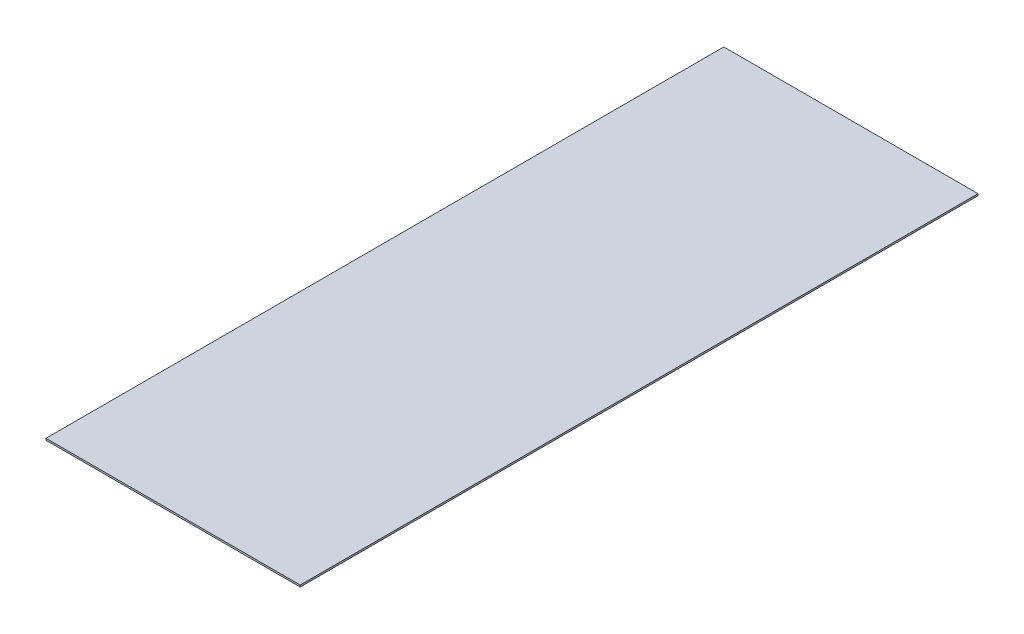
ISO-10303-21;
HEADER;
FILE_DESCRIPTION(('STEP AP214'),'2;1');
FILE_NAME('part.step','',(''),(''),'','','');
FILE_SCHEMA(('AUTOMOTIVE_DESIGN { 1 0 10303 214 1 1 1 1 }'));
ENDSEC;
DATA;
#1=APPLICATION_CONTEXT('core data for automotive mechanical design processes');
#2=APPLICATION_PROTOCOL_DEFINITION('international standard','automotive_design',2000,#1);
#3=PRODUCT_CONTEXT('',#1,'mechanical');
#4=PRODUCT('Part','Part','',(#3));
#5=PRODUCT_RELATED_PRODUCT_CATEGORY('part','',(#4));
#6=PRODUCT_DEFINITION_FORMATION('','',#4);
#7=PRODUCT_DEFINITION_CONTEXT('part definition',#1,'design');
#8=PRODUCT_DEFINITION('design','',#6,#7);
#9=PRODUCT_DEFINITION_SHAPE('','',#8);
#10=(LENGTH_UNIT() NAMED_UNIT(*) SI_UNIT(.MILLI.,.METRE.));
#11=(NAMED_UNIT(*) PLANE_ANGLE_UNIT() SI_UNIT($,.RADIAN.));
#12=(NAMED_UNIT(*) SI_UNIT($,.STERADIAN.) SOLID_ANGLE_UNIT());
#13=UNCERTAINTY_MEASURE_WITH_UNIT(LENGTH_MEASURE(1.E-05),#10,'distance_accuracy_value','');
#14=(GEOMETRIC_REPRESENTATION_CONTEXT(3) GLOBAL_UNCERTAINTY_ASSIGNED_CONTEXT((#13)) GLOBAL_UNIT_ASSIGNED_CONTEXT((#10,
#11,#12)) REPRESENTATION_CONTEXT('',''));
#15=CARTESIAN_POINT('',(0.,0.,0.));
#16=DIRECTION('',(0.,0.,1.));
#17=DIRECTION('',(1.,0.,0.));
#18=AXIS2_PLACEMENT_3D('',#15,#16,#17);
#19=CARTESIAN_POINT('',(457.2,6.4,1219.2));
#20=DIRECTION('',(-1.,0.,0.));
#21=DIRECTION('',(0.,0.,1.));
#22=AXIS2_PLACEMENT_3D('',#19,#20,#21);
#23=PLANE('',#22);
#24=DIRECTION('',(0.,0.,-1.));
#25=VECTOR('',#24,1.);
#26=CARTESIAN_POINT('',(457.2,0.,1219.2));
#27=LINE('',#26,#25);
#28=CARTESIAN_POINT('',(457.2,0.,1219.2));
#29=VERTEX_POINT('',#28);
#30=CARTESIAN_POINT('',(457.2,0.,-1219.2));
#31=VERTEX_POINT('',#30);
#32=EDGE_CURVE('E96',#29,#31,#27,.T.);
#33=ORIENTED_EDGE('',*,*,#32,.T.);
#34=DIRECTION('',(0.,-1.,0.));
#35=VECTOR('',#34,1.);
#36=CARTESIAN_POINT('',(457.2,6.4,-1219.2));
#37=LINE('',#36,#35);
#38=CARTESIAN_POINT('',(457.2,6.4,-1219.2));
#39=VERTEX_POINT('',#38);
#40=EDGE_CURVE('E11',#39,#31,#37,.T.);
#41=ORIENTED_EDGE('',*,*,#40,.F.);
#42=DIRECTION('',(0.,0.,-1.));
#43=VECTOR('',#42,1.);
#44=CARTESIAN_POINT('',(457.2,6.4,1219.2));
#45=LINE('',#44,#43);
#46=CARTESIAN_POINT('',(457.2,6.4,1219.2));
#47=VERTEX_POINT('',#46);
#48=EDGE_CURVE('E84',#47,#39,#45,.T.);
#49=ORIENTED_EDGE('',*,*,#48,.F.);
#50=DIRECTION('',(0.,-1.,0.));
#51=VECTOR('',#50,1.);
#52=CARTESIAN_POINT('',(457.2,6.4,1219.2));
#53=LINE('',#52,#51);
#54=EDGE_CURVE('E92',#47,#29,#53,.T.);
#55=ORIENTED_EDGE('',*,*,#54,.T.);
#56=EDGE_LOOP('',(#33,#41,#49,#55));
#57=FACE_BOUND('',#56,.T.);
#58=ADVANCED_FACE('F33',(#57),#23,.F.);
#59=CARTESIAN_POINT('',(-457.2,6.4,-1219.2));
#60=DIRECTION('',(0.,0.,1.));
#61=DIRECTION('',(1.,0.,0.));
#62=AXIS2_PLACEMENT_3D('',#59,#60,#61);
#63=PLANE('',#62);
#64=DIRECTION('',(-1.,0.,0.));
#65=VECTOR('',#64,1.);
#66=CARTESIAN_POINT('',(-457.2,0.,-1219.2));
#67=LINE('',#66,#65);
#68=CARTESIAN_POINT('',(-457.2,0.,-1219.2));
#69=VERTEX_POINT('',#68);
#70=EDGE_CURVE('E88',#31,#69,#67,.T.);
#71=ORIENTED_EDGE('',*,*,#70,.T.);
#72=DIRECTION('',(0.,-1.,0.));
#73=VECTOR('',#72,1.);
#74=CARTESIAN_POINT('',(-457.2,6.4,-1219.2));
#75=LINE('',#74,#73);
#76=CARTESIAN_POINT('',(-457.2,6.4,-1219.2));
#77=VERTEX_POINT('',#76);
#78=EDGE_CURVE('E41',#77,#69,#75,.T.);
#79=ORIENTED_EDGE('',*,*,#78,.F.);
#80=DIRECTION('',(-1.,0.,0.));
#81=VECTOR('',#80,1.);
#82=CARTESIAN_POINT('',(-457.2,6.4,-1219.2));
#83=LINE('',#82,#81);
#84=EDGE_CURVE('E79',#39,#77,#83,.T.);
#85=ORIENTED_EDGE('',*,*,#84,.F.);
#86=ORIENTED_EDGE('',*,*,#40,.T.);
#87=EDGE_LOOP('',(#71,#79,#85,#86));
#88=FACE_BOUND('',#87,.T.);
#89=ADVANCED_FACE('F87',(#88),#63,.F.);
#90=CARTESIAN_POINT('',(-457.2,6.4,1219.2));
#91=DIRECTION('',(1.,0.,0.));
#92=DIRECTION('',(0.,0.,-1.));
#93=AXIS2_PLACEMENT_3D('',#90,#91,#92);
#94=PLANE('',#93);
#95=DIRECTION('',(0.,0.,1.));
#96=VECTOR('',#95,1.);
#97=CARTESIAN_POINT('',(-457.2,0.,1219.2));
#98=LINE('',#97,#96);
#99=CARTESIAN_POINT('',(-457.2,0.,1219.2));
#100=VERTEX_POINT('',#99);
#101=EDGE_CURVE('E66',#69,#100,#98,.T.);
#102=ORIENTED_EDGE('',*,*,#101,.T.);
#103=DIRECTION('',(0.,-1.,0.));
#104=VECTOR('',#103,1.);
#105=CARTESIAN_POINT('',(-457.2,6.4,1219.2));
#106=LINE('',#105,#104);
#107=CARTESIAN_POINT('',(-457.2,6.4,1219.2));
#108=VERTEX_POINT('',#107);
#109=EDGE_CURVE('E89',#108,#100,#106,.T.);
#110=ORIENTED_EDGE('',*,*,#109,.F.);
#111=DIRECTION('',(0.,0.,1.));
#112=VECTOR('',#111,1.);
#113=CARTESIAN_POINT('',(-457.2,6.4,1219.2));
#114=LINE('',#113,#112);
#115=EDGE_CURVE('E82',#77,#108,#114,.T.);
#116=ORIENTED_EDGE('',*,*,#115,.F.);
#117=ORIENTED_EDGE('',*,*,#78,.T.);
#118=EDGE_LOOP('',(#102,#110,#116,#117));
#119=FACE_BOUND('',#118,.T.);
#120=ADVANCED_FACE('F90',(#119),#94,.F.);
#121=CARTESIAN_POINT('',(-457.2,6.4,1219.2));
#122=DIRECTION('',(0.,0.,-1.));
#123=DIRECTION('',(-1.,0.,0.));
#124=AXIS2_PLACEMENT_3D('',#121,#122,#123);
#125=PLANE('',#124);
#126=DIRECTION('',(1.,0.,0.));
#127=VECTOR('',#126,1.);
#128=CARTESIAN_POINT('',(-457.2,0.,1219.2));
#129=LINE('',#128,#127);
#130=EDGE_CURVE('E72',#100,#29,#129,.T.);
#131=ORIENTED_EDGE('',*,*,#130,.T.);
#132=ORIENTED_EDGE('',*,*,#54,.F.);
#133=DIRECTION('',(1.,0.,0.));
#134=VECTOR('',#133,1.);
#135=CARTESIAN_POINT('',(-457.2,6.4,1219.2));
#136=LINE('',#135,#134);
#137=EDGE_CURVE('E49',#108,#47,#136,.T.);
#138=ORIENTED_EDGE('',*,*,#137,.F.);
#139=ORIENTED_EDGE('',*,*,#109,.T.);
#140=EDGE_LOOP('',(#131,#132,#138,#139));
#141=FACE_BOUND('',#140,.T.);
#142=ADVANCED_FACE('F103',(#141),#125,.F.);
#143=CARTESIAN_POINT('',(0.,6.4,0.));
#144=DIRECTION('',(0.,-1.,0.));
#145=DIRECTION('',(0.,0.,-1.));
#146=AXIS2_PLACEMENT_3D('',#143,#144,#145);
#147=PLANE('',#146);
#148=ORIENTED_EDGE('',*,*,#48,.T.);
#149=ORIENTED_EDGE('',*,*,#84,.T.);
#150=ORIENTED_EDGE('',*,*,#115,.T.);
#151=ORIENTED_EDGE('',*,*,#137,.T.);
#152=EDGE_LOOP('',(#148,#149,#150,#151));
#153=FACE_BOUND('',#152,.T.);
#154=ADVANCED_FACE('F80',(#153),#147,.F.);
#155=CARTESIAN_POINT('',(0.,0.,0.));
#156=DIRECTION('',(0.,-1.,0.));
#157=DIRECTION('',(0.,0.,-1.));
#158=AXIS2_PLACEMENT_3D('',#155,#156,#157);
#159=PLANE('',#158);
#160=ORIENTED_EDGE('',*,*,#32,.F.);
#161=ORIENTED_EDGE('',*,*,#130,.F.);
#162=ORIENTED_EDGE('',*,*,#101,.F.);
#163=ORIENTED_EDGE('',*,*,#70,.F.);
#164=EDGE_LOOP('',(#160,#161,#162,#163));
#165=FACE_BOUND('',#164,.T.);
#166=ADVANCED_FACE('F106',(#165),#159,.T.);
#167=CLOSED_SHELL('',(#58,#89,#120,#142,#154,#166));
#168=MANIFOLD_SOLID_BREP('B2',#167);
#169=ADVANCED_BREP_SHAPE_REPRESENTATION('',(#18,#168),#14);
#170=SHAPE_DEFINITION_REPRESENTATION(#9,#169);
ENDSEC;
END-ISO-10303-21;
